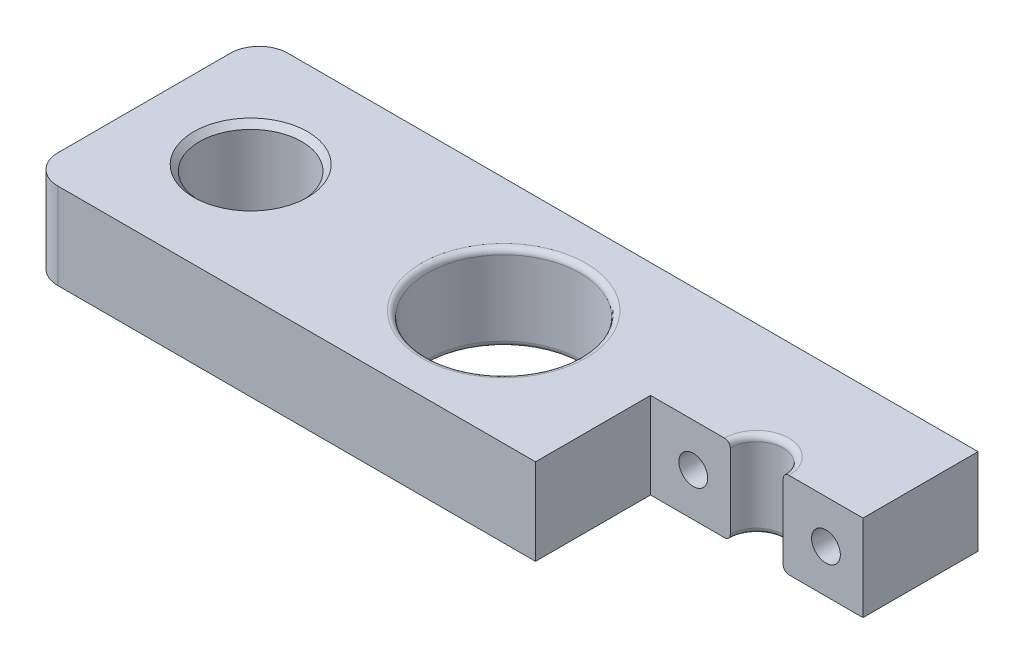
ISO-10303-21;
HEADER;
FILE_DESCRIPTION(('STEP AP214'),'2;1');
FILE_NAME('part.step','',(''),(''),'','','');
FILE_SCHEMA(('AUTOMOTIVE_DESIGN { 1 0 10303 214 1 1 1 1 }'));
ENDSEC;
DATA;
#1=APPLICATION_CONTEXT('core data for automotive mechanical design processes');
#2=APPLICATION_PROTOCOL_DEFINITION('international standard','automotive_design',2000,#1);
#3=PRODUCT_CONTEXT('',#1,'mechanical');
#4=PRODUCT('Part','Part','',(#3));
#5=PRODUCT_RELATED_PRODUCT_CATEGORY('part','',(#4));
#6=PRODUCT_DEFINITION_FORMATION('','',#4);
#7=PRODUCT_DEFINITION_CONTEXT('part definition',#1,'design');
#8=PRODUCT_DEFINITION('design','',#6,#7);
#9=PRODUCT_DEFINITION_SHAPE('','',#8);
#10=(LENGTH_UNIT() NAMED_UNIT(*) SI_UNIT(.MILLI.,.METRE.));
#11=(NAMED_UNIT(*) PLANE_ANGLE_UNIT() SI_UNIT($,.RADIAN.));
#12=(NAMED_UNIT(*) SI_UNIT($,.STERADIAN.) SOLID_ANGLE_UNIT());
#13=UNCERTAINTY_MEASURE_WITH_UNIT(LENGTH_MEASURE(1.E-05),#10,'distance_accuracy_value','');
#14=(GEOMETRIC_REPRESENTATION_CONTEXT(3) GLOBAL_UNCERTAINTY_ASSIGNED_CONTEXT((#13)) GLOBAL_UNIT_ASSIGNED_CONTEXT((#10,
#11,#12)) REPRESENTATION_CONTEXT('',''));
#15=CARTESIAN_POINT('',(0.,0.,0.));
#16=DIRECTION('',(0.,0.,1.));
#17=DIRECTION('',(1.,0.,0.));
#18=AXIS2_PLACEMENT_3D('',#15,#16,#17);
#19=CARTESIAN_POINT('',(0.,15.,0.));
#20=DIRECTION('',(1.,0.,0.));
#21=DIRECTION('',(0.,0.,-1.));
#22=AXIS2_PLACEMENT_3D('',#19,#20,#21);
#23=PLANE('',#22);
#24=DIRECTION('',(0.,0.,1.));
#25=VECTOR('',#24,1.);
#26=CARTESIAN_POINT('',(0.,15.,0.));
#27=LINE('',#26,#25);
#28=CARTESIAN_POINT('',(0.,15.,-35.));
#29=VERTEX_POINT('',#28);
#30=CARTESIAN_POINT('',(0.,15.,-5.));
#31=VERTEX_POINT('',#30);
#32=EDGE_CURVE('E173',#29,#31,#27,.T.);
#33=ORIENTED_EDGE('',*,*,#32,.F.);
#34=DIRECTION('',(0.,-1.,0.));
#35=VECTOR('',#34,1.);
#36=CARTESIAN_POINT('',(0.,15.,-35.));
#37=LINE('',#36,#35);
#38=CARTESIAN_POINT('',(0.,0.,-35.));
#39=VERTEX_POINT('',#38);
#40=EDGE_CURVE('E230',#29,#39,#37,.T.);
#41=ORIENTED_EDGE('',*,*,#40,.T.);
#42=DIRECTION('',(0.,0.,1.));
#43=VECTOR('',#42,1.);
#44=CARTESIAN_POINT('',(0.,0.,0.));
#45=LINE('',#44,#43);
#46=CARTESIAN_POINT('',(0.,0.,-5.));
#47=VERTEX_POINT('',#46);
#48=EDGE_CURVE('E134',#39,#47,#45,.T.);
#49=ORIENTED_EDGE('',*,*,#48,.T.);
#50=DIRECTION('',(0.,-1.,0.));
#51=VECTOR('',#50,1.);
#52=CARTESIAN_POINT('',(0.,15.,-5.));
#53=LINE('',#52,#51);
#54=EDGE_CURVE('E228',#47,#31,#53,.F.);
#55=ORIENTED_EDGE('',*,*,#54,.T.);
#56=EDGE_LOOP('',(#33,#41,#49,#55));
#57=FACE_BOUND('',#56,.T.);
#58=ADVANCED_FACE('F33',(#57),#23,.F.);
#59=CARTESIAN_POINT('',(0.,15.,0.));
#60=DIRECTION('',(0.,0.,-1.));
#61=DIRECTION('',(-1.,0.,0.));
#62=AXIS2_PLACEMENT_3D('',#59,#60,#61);
#63=PLANE('',#62);
#64=DIRECTION('',(1.,0.,0.));
#65=VECTOR('',#64,1.);
#66=CARTESIAN_POINT('',(0.,15.,0.));
#67=LINE('',#66,#65);
#68=CARTESIAN_POINT('',(5.,15.,0.));
#69=VERTEX_POINT('',#68);
#70=CARTESIAN_POINT('',(88.06,15.,0.));
#71=VERTEX_POINT('',#70);
#72=EDGE_CURVE('E175',#69,#71,#67,.T.);
#73=ORIENTED_EDGE('',*,*,#72,.F.);
#74=DIRECTION('',(0.,-1.,0.));
#75=VECTOR('',#74,1.);
#76=CARTESIAN_POINT('',(5.,15.,0.));
#77=LINE('',#76,#75);
#78=CARTESIAN_POINT('',(5.,0.,0.));
#79=VERTEX_POINT('',#78);
#80=EDGE_CURVE('E11',#69,#79,#77,.T.);
#81=ORIENTED_EDGE('',*,*,#80,.T.);
#82=DIRECTION('',(1.,0.,0.));
#83=VECTOR('',#82,1.);
#84=CARTESIAN_POINT('',(0.,0.,0.));
#85=LINE('',#84,#83);
#86=CARTESIAN_POINT('',(88.06,0.,0.));
#87=VERTEX_POINT('',#86);
#88=EDGE_CURVE('E125',#79,#87,#85,.T.);
#89=ORIENTED_EDGE('',*,*,#88,.T.);
#90=DIRECTION('',(0.,1.,0.));
#91=VECTOR('',#90,1.);
#92=CARTESIAN_POINT('',(88.06,-20.2327358505962,0.));
#93=LINE('',#92,#91);
#94=EDGE_CURVE('E129',#87,#71,#93,.T.);
#95=ORIENTED_EDGE('',*,*,#94,.T.);
#96=EDGE_LOOP('',(#73,#81,#89,#95));
#97=FACE_BOUND('',#96,.T.);
#98=ADVANCED_FACE('F127',(#97),#63,.F.);
#99=CARTESIAN_POINT('',(125.,15.,0.));
#100=DIRECTION('',(-1.,0.,0.));
#101=DIRECTION('',(0.,0.,1.));
#102=AXIS2_PLACEMENT_3D('',#99,#100,#101);
#103=PLANE('',#102);
#104=DIRECTION('',(0.,0.,-1.));
#105=VECTOR('',#104,1.);
#106=CARTESIAN_POINT('',(125.,15.,0.));
#107=LINE('',#106,#105);
#108=CARTESIAN_POINT('',(125.,15.,-20.));
#109=VERTEX_POINT('',#108);
#110=CARTESIAN_POINT('',(125.,15.,-40.));
#111=VERTEX_POINT('',#110);
#112=EDGE_CURVE('E178',#109,#111,#107,.T.);
#113=ORIENTED_EDGE('',*,*,#112,.F.);
#114=DIRECTION('',(0.,1.,0.));
#115=VECTOR('',#114,1.);
#116=CARTESIAN_POINT('',(125.,0.,-20.));
#117=LINE('',#116,#115);
#118=CARTESIAN_POINT('',(125.,0.,-20.));
#119=VERTEX_POINT('',#118);
#120=EDGE_CURVE('E158',#119,#109,#117,.T.);
#121=ORIENTED_EDGE('',*,*,#120,.F.);
#122=DIRECTION('',(0.,0.,-1.));
#123=VECTOR('',#122,1.);
#124=CARTESIAN_POINT('',(125.,0.,0.));
#125=LINE('',#124,#123);
#126=CARTESIAN_POINT('',(125.,0.,-40.));
#127=VERTEX_POINT('',#126);
#128=EDGE_CURVE('E133',#119,#127,#125,.T.);
#129=ORIENTED_EDGE('',*,*,#128,.T.);
#130=DIRECTION('',(0.,-1.,0.));
#131=VECTOR('',#130,1.);
#132=CARTESIAN_POINT('',(125.,15.,-40.));
#133=LINE('',#132,#131);
#134=EDGE_CURVE('E182',#111,#127,#133,.T.);
#135=ORIENTED_EDGE('',*,*,#134,.F.);
#136=EDGE_LOOP('',(#113,#121,#129,#135));
#137=FACE_BOUND('',#136,.T.);
#138=ADVANCED_FACE('F253',(#137),#103,.F.);
#139=CARTESIAN_POINT('',(0.,15.,-40.));
#140=DIRECTION('',(0.,0.,1.));
#141=DIRECTION('',(1.,0.,0.));
#142=AXIS2_PLACEMENT_3D('',#139,#140,#141);
#143=PLANE('',#142);
#144=CARTESIAN_POINT('',(118.565,7.5,-40.));
#145=DIRECTION('',(0.,0.,1.));
#146=DIRECTION('',(1.,0.,0.));
#147=AXIS2_PLACEMENT_3D('',#144,#145,#146);
#148=CIRCLE('',#147,2.5);
#149=CARTESIAN_POINT('',(121.065,7.5,-40.));
#150=VERTEX_POINT('',#149);
#151=EDGE_CURVE('E151',#150,#150,#148,.T.);
#152=ORIENTED_EDGE('',*,*,#151,.T.);
#153=EDGE_LOOP('',(#152));
#154=FACE_BOUND('',#153,.T.);
#155=CARTESIAN_POINT('',(95.4916685270529,7.5,-40.));
#156=DIRECTION('',(0.,0.,1.));
#157=DIRECTION('',(1.,0.,0.));
#158=AXIS2_PLACEMENT_3D('',#155,#156,#157);
#159=CIRCLE('',#158,2.49999999999999);
#160=CARTESIAN_POINT('',(97.9916685270529,7.5,-40.));
#161=VERTEX_POINT('',#160);
#162=EDGE_CURVE('E495',#161,#161,#159,.T.);
#163=ORIENTED_EDGE('',*,*,#162,.T.);
#164=EDGE_LOOP('',(#163));
#165=FACE_BOUND('',#164,.T.);
#166=DIRECTION('',(-1.,0.,0.));
#167=VECTOR('',#166,1.);
#168=CARTESIAN_POINT('',(0.,0.,-40.));
#169=LINE('',#168,#167);
#170=CARTESIAN_POINT('',(5.,0.,-40.));
#171=VERTEX_POINT('',#170);
#172=EDGE_CURVE('E176',#127,#171,#169,.T.);
#173=ORIENTED_EDGE('',*,*,#172,.T.);
#174=DIRECTION('',(0.,-1.,0.));
#175=VECTOR('',#174,1.);
#176=CARTESIAN_POINT('',(5.,15.,-40.));
#177=LINE('',#176,#175);
#178=CARTESIAN_POINT('',(5.,15.,-40.));
#179=VERTEX_POINT('',#178);
#180=EDGE_CURVE('E56',#171,#179,#177,.F.);
#181=ORIENTED_EDGE('',*,*,#180,.T.);
#182=DIRECTION('',(-1.,0.,0.));
#183=VECTOR('',#182,1.);
#184=CARTESIAN_POINT('',(0.,15.,-40.));
#185=LINE('',#184,#183);
#186=EDGE_CURVE('E180',#111,#179,#185,.T.);
#187=ORIENTED_EDGE('',*,*,#186,.F.);
#188=ORIENTED_EDGE('',*,*,#134,.T.);
#189=EDGE_LOOP('',(#173,#181,#187,#188));
#190=FACE_BOUND('',#189,.T.);
#191=ADVANCED_FACE('F249',(#154,#165,#190),#143,.F.);
#192=CARTESIAN_POINT('',(0.,15.,0.));
#193=DIRECTION('',(0.,-1.,0.));
#194=DIRECTION('',(0.,0.,-1.));
#195=AXIS2_PLACEMENT_3D('',#192,#193,#194);
#196=PLANE('',#195);
#197=ORIENTED_EDGE('',*,*,#186,.T.);
#198=CARTESIAN_POINT('',(5.,15.,-35.));
#199=DIRECTION('',(0.,-1.,0.));
#200=DIRECTION('',(0.,0.,-1.));
#201=AXIS2_PLACEMENT_3D('',#198,#199,#200);
#202=CIRCLE('',#201,5.);
#203=EDGE_CURVE('E41',#179,#29,#202,.F.);
#204=ORIENTED_EDGE('',*,*,#203,.T.);
#205=ORIENTED_EDGE('',*,*,#32,.T.);
#206=CARTESIAN_POINT('',(5.,15.,-5.));
#207=DIRECTION('',(0.,-1.,0.));
#208=DIRECTION('',(0.,0.,-1.));
#209=AXIS2_PLACEMENT_3D('',#206,#207,#208);
#210=CIRCLE('',#209,5.);
#211=EDGE_CURVE('E48',#31,#69,#210,.F.);
#212=ORIENTED_EDGE('',*,*,#211,.T.);
#213=ORIENTED_EDGE('',*,*,#72,.T.);
#214=DIRECTION('',(0.,0.,-1.));
#215=VECTOR('',#214,1.);
#216=CARTESIAN_POINT('',(88.06,15.,-20.));
#217=LINE('',#216,#215);
#218=CARTESIAN_POINT('',(88.06,15.,-20.));
#219=VERTEX_POINT('',#218);
#220=EDGE_CURVE('E149',#71,#219,#217,.T.);
#221=ORIENTED_EDGE('',*,*,#220,.T.);
#222=DIRECTION('',(-1.,0.,0.));
#223=VECTOR('',#222,1.);
#224=CARTESIAN_POINT('',(85.,15.,-20.));
#225=LINE('',#224,#223);
#226=CARTESIAN_POINT('',(100.926668527053,15.,-20.));
#227=VERTEX_POINT('',#226);
#228=EDGE_CURVE('E161',#227,#219,#225,.T.);
#229=ORIENTED_EDGE('',*,*,#228,.F.);
#230=CARTESIAN_POINT('',(106.526668527053,15.,-20.));
#231=DIRECTION('',(0.,-1.,0.));
#232=DIRECTION('',(0.,0.,-1.));
#233=AXIS2_PLACEMENT_3D('',#230,#231,#232);
#234=CIRCLE('',#233,5.60000000000001);
#235=CARTESIAN_POINT('',(112.126668527053,15.,-20.));
#236=VERTEX_POINT('',#235);
#237=EDGE_CURVE('E221',#227,#236,#234,.T.);
#238=ORIENTED_EDGE('',*,*,#237,.T.);
#239=EDGE_CURVE('E159',#109,#236,#225,.T.);
#240=ORIENTED_EDGE('',*,*,#239,.F.);
#241=ORIENTED_EDGE('',*,*,#112,.T.);
#242=EDGE_LOOP('',(#197,#204,#205,#212,#213,#221,#229,#238,#240,#241));
#243=FACE_BOUND('',#242,.T.);
#244=CARTESIAN_POINT('',(62.5266685270529,15.,-20.));
#245=DIRECTION('',(0.,-1.,0.));
#246=DIRECTION('',(0.,0.,-1.));
#247=AXIS2_PLACEMENT_3D('',#244,#245,#246);
#248=CIRCLE('',#247,14.3);
#249=CARTESIAN_POINT('',(62.5266685270529,15.,-34.3));
#250=VERTEX_POINT('',#249);
#251=EDGE_CURVE('E218',#250,#250,#248,.T.);
#252=ORIENTED_EDGE('',*,*,#251,.T.);
#253=EDGE_LOOP('',(#252));
#254=FACE_BOUND('',#253,.T.);
#255=CARTESIAN_POINT('',(18.5266685270529,15.,-20.));
#256=DIRECTION('',(0.,-1.,0.));
#257=DIRECTION('',(0.,0.,-1.));
#258=AXIS2_PLACEMENT_3D('',#255,#256,#257);
#259=CIRCLE('',#258,9.90000000000002);
#260=CARTESIAN_POINT('',(18.5266685270529,15.,-29.9));
#261=VERTEX_POINT('',#260);
#262=EDGE_CURVE('E192',#261,#261,#259,.T.);
#263=ORIENTED_EDGE('',*,*,#262,.T.);
#264=EDGE_LOOP('',(#263));
#265=FACE_BOUND('',#264,.T.);
#266=ADVANCED_FACE('F240',(#243,#254,#265),#196,.F.);
#267=CARTESIAN_POINT('',(0.,0.,0.));
#268=DIRECTION('',(0.,-1.,0.));
#269=DIRECTION('',(0.,0.,-1.));
#270=AXIS2_PLACEMENT_3D('',#267,#268,#269);
#271=PLANE('',#270);
#272=ORIENTED_EDGE('',*,*,#48,.F.);
#273=CARTESIAN_POINT('',(5.,0.,-35.));
#274=DIRECTION('',(0.,-1.,0.));
#275=DIRECTION('',(0.,0.,-1.));
#276=AXIS2_PLACEMENT_3D('',#273,#274,#275);
#277=CIRCLE('',#276,5.);
#278=EDGE_CURVE('E235',#39,#171,#277,.T.);
#279=ORIENTED_EDGE('',*,*,#278,.T.);
#280=ORIENTED_EDGE('',*,*,#172,.F.);
#281=ORIENTED_EDGE('',*,*,#128,.F.);
#282=DIRECTION('',(-1.,0.,0.));
#283=VECTOR('',#282,1.);
#284=CARTESIAN_POINT('',(85.,0.,-20.));
#285=LINE('',#284,#283);
#286=CARTESIAN_POINT('',(112.126668527053,0.,-20.));
#287=VERTEX_POINT('',#286);
#288=EDGE_CURVE('E155',#119,#287,#285,.T.);
#289=ORIENTED_EDGE('',*,*,#288,.T.);
#290=CARTESIAN_POINT('',(106.526668527053,0.,-20.));
#291=DIRECTION('',(0.,-1.,0.));
#292=DIRECTION('',(0.,0.,-1.));
#293=AXIS2_PLACEMENT_3D('',#290,#291,#292);
#294=CIRCLE('',#293,5.60000000000001);
#295=CARTESIAN_POINT('',(100.926668527053,0.,-20.));
#296=VERTEX_POINT('',#295);
#297=EDGE_CURVE('E201',#287,#296,#294,.F.);
#298=ORIENTED_EDGE('',*,*,#297,.T.);
#299=CARTESIAN_POINT('',(88.06,0.,-20.));
#300=VERTEX_POINT('',#299);
#301=EDGE_CURVE('E142',#296,#300,#285,.T.);
#302=ORIENTED_EDGE('',*,*,#301,.T.);
#303=DIRECTION('',(0.,0.,-1.));
#304=VECTOR('',#303,1.);
#305=CARTESIAN_POINT('',(88.06,0.,-20.));
#306=LINE('',#305,#304);
#307=EDGE_CURVE('E137',#87,#300,#306,.T.);
#308=ORIENTED_EDGE('',*,*,#307,.F.);
#309=ORIENTED_EDGE('',*,*,#88,.F.);
#310=CARTESIAN_POINT('',(5.,0.,-5.));
#311=DIRECTION('',(0.,-1.,0.));
#312=DIRECTION('',(0.,0.,-1.));
#313=AXIS2_PLACEMENT_3D('',#310,#311,#312);
#314=CIRCLE('',#313,5.);
#315=EDGE_CURVE('E233',#79,#47,#314,.T.);
#316=ORIENTED_EDGE('',*,*,#315,.T.);
#317=EDGE_LOOP('',(#272,#279,#280,#281,#289,#298,#302,#308,#309,#316));
#318=FACE_BOUND('',#317,.T.);
#319=CARTESIAN_POINT('',(62.5266685270529,0.,-20.));
#320=DIRECTION('',(0.,-1.,0.));
#321=DIRECTION('',(0.,0.,-1.));
#322=AXIS2_PLACEMENT_3D('',#319,#320,#321);
#323=CIRCLE('',#322,14.3);
#324=CARTESIAN_POINT('',(62.5266685270529,0.,-34.3));
#325=VERTEX_POINT('',#324);
#326=EDGE_CURVE('E203',#325,#325,#323,.F.);
#327=ORIENTED_EDGE('',*,*,#326,.T.);
#328=EDGE_LOOP('',(#327));
#329=FACE_BOUND('',#328,.T.);
#330=CARTESIAN_POINT('',(18.5266685270529,0.,-20.));
#331=DIRECTION('',(0.,-1.,0.));
#332=DIRECTION('',(0.,0.,-1.));
#333=AXIS2_PLACEMENT_3D('',#330,#331,#332);
#334=CIRCLE('',#333,9.89999999999996);
#335=CARTESIAN_POINT('',(18.5266685270529,0.,-29.9));
#336=VERTEX_POINT('',#335);
#337=EDGE_CURVE('E195',#336,#336,#334,.F.);
#338=ORIENTED_EDGE('',*,*,#337,.T.);
#339=EDGE_LOOP('',(#338));
#340=FACE_BOUND('',#339,.T.);
#341=ADVANCED_FACE('F139',(#318,#329,#340),#271,.T.);
#342=CARTESIAN_POINT('',(62.5266685270529,0.,-20.));
#343=DIRECTION('',(0.,1.,0.));
#344=DIRECTION('',(0.,0.,1.));
#345=AXIS2_PLACEMENT_3D('',#342,#343,#344);
#346=CYLINDRICAL_SURFACE('',#345,13.3);
#347=CARTESIAN_POINT('',(62.5266685270529,1.,-20.));
#348=DIRECTION('',(0.,-1.,0.));
#349=DIRECTION('',(0.,0.,-1.));
#350=AXIS2_PLACEMENT_3D('',#347,#348,#349);
#351=CIRCLE('',#350,13.3);
#352=CARTESIAN_POINT('',(62.5266685270529,1.,-33.3));
#353=VERTEX_POINT('',#352);
#354=EDGE_CURVE('E209',#353,#353,#351,.T.);
#355=ORIENTED_EDGE('',*,*,#354,.T.);
#356=EDGE_LOOP('',(#355));
#357=FACE_BOUND('',#356,.T.);
#358=CARTESIAN_POINT('',(62.5266685270529,14.,-20.));
#359=DIRECTION('',(0.,-1.,0.));
#360=DIRECTION('',(0.,0.,-1.));
#361=AXIS2_PLACEMENT_3D('',#358,#359,#360);
#362=CIRCLE('',#361,13.3);
#363=CARTESIAN_POINT('',(62.5266685270529,14.,-33.3));
#364=VERTEX_POINT('',#363);
#365=EDGE_CURVE('E206',#364,#364,#362,.F.);
#366=ORIENTED_EDGE('',*,*,#365,.T.);
#367=EDGE_LOOP('',(#366));
#368=FACE_BOUND('',#367,.T.);
#369=ADVANCED_FACE('F321',(#357,#368),#346,.F.);
#370=CARTESIAN_POINT('',(106.526668527053,0.,-20.));
#371=DIRECTION('',(0.,1.,0.));
#372=DIRECTION('',(0.,0.,1.));
#373=AXIS2_PLACEMENT_3D('',#370,#371,#372);
#374=CYLINDRICAL_SURFACE('',#373,4.60000000000001);
#375=CARTESIAN_POINT('',(106.526668527053,14.,-20.));
#376=DIRECTION('',(0.,-1.,0.));
#377=DIRECTION('',(0.,0.,-1.));
#378=AXIS2_PLACEMENT_3D('',#375,#376,#377);
#379=CIRCLE('',#378,4.60000000000001);
#380=CARTESIAN_POINT('',(111.126668527053,14.,-20.));
#381=VERTEX_POINT('',#380);
#382=CARTESIAN_POINT('',(101.926668527053,14.,-20.));
#383=VERTEX_POINT('',#382);
#384=EDGE_CURVE('E212',#381,#383,#379,.F.);
#385=ORIENTED_EDGE('',*,*,#384,.T.);
#386=DIRECTION('',(0.,1.,0.));
#387=VECTOR('',#386,1.);
#388=CARTESIAN_POINT('',(101.926668527053,0.,-20.));
#389=LINE('',#388,#387);
#390=CARTESIAN_POINT('',(101.926668527053,1.,-20.));
#391=VERTEX_POINT('',#390);
#392=EDGE_CURVE('E163',#383,#391,#389,.F.);
#393=ORIENTED_EDGE('',*,*,#392,.T.);
#394=CARTESIAN_POINT('',(106.526668527053,1.,-20.));
#395=DIRECTION('',(0.,-1.,0.));
#396=DIRECTION('',(0.,0.,-1.));
#397=AXIS2_PLACEMENT_3D('',#394,#395,#396);
#398=CIRCLE('',#397,4.60000000000001);
#399=CARTESIAN_POINT('',(111.126668527053,1.,-20.));
#400=VERTEX_POINT('',#399);
#401=EDGE_CURVE('E215',#391,#400,#398,.T.);
#402=ORIENTED_EDGE('',*,*,#401,.T.);
#403=DIRECTION('',(0.,1.,0.));
#404=VECTOR('',#403,1.);
#405=CARTESIAN_POINT('',(111.126668527053,0.,-20.));
#406=LINE('',#405,#404);
#407=EDGE_CURVE('E168',#400,#381,#406,.T.);
#408=ORIENTED_EDGE('',*,*,#407,.T.);
#409=EDGE_LOOP('',(#385,#393,#402,#408));
#410=FACE_BOUND('',#409,.T.);
#411=ADVANCED_FACE('F267',(#410),#374,.F.);
#412=CARTESIAN_POINT('',(18.5266685270529,0.,-20.));
#413=DIRECTION('',(0.,1.,0.));
#414=DIRECTION('',(0.,0.,1.));
#415=AXIS2_PLACEMENT_3D('',#412,#413,#414);
#416=CYLINDRICAL_SURFACE('',#415,8.9);
#417=CARTESIAN_POINT('',(18.5266685270529,0.999999999999977,-20.));
#418=DIRECTION('',(0.,-1.,0.));
#419=DIRECTION('',(0.,0.,-1.));
#420=AXIS2_PLACEMENT_3D('',#417,#418,#419);
#421=CIRCLE('',#420,8.9);
#422=CARTESIAN_POINT('',(18.5266685270529,0.999999999999977,-28.9));
#423=VERTEX_POINT('',#422);
#424=EDGE_CURVE('E198',#423,#423,#421,.T.);
#425=ORIENTED_EDGE('',*,*,#424,.T.);
#426=EDGE_LOOP('',(#425));
#427=FACE_BOUND('',#426,.T.);
#428=CARTESIAN_POINT('',(18.5266685270529,14.,-20.));
#429=DIRECTION('',(0.,-1.,0.));
#430=DIRECTION('',(0.,0.,-1.));
#431=AXIS2_PLACEMENT_3D('',#428,#429,#430);
#432=CIRCLE('',#431,8.9);
#433=CARTESIAN_POINT('',(18.5266685270529,14.,-28.9));
#434=VERTEX_POINT('',#433);
#435=EDGE_CURVE('E189',#434,#434,#432,.F.);
#436=ORIENTED_EDGE('',*,*,#435,.T.);
#437=EDGE_LOOP('',(#436));
#438=FACE_BOUND('',#437,.T.);
#439=ADVANCED_FACE('F296',(#427,#438),#416,.F.);
#440=CARTESIAN_POINT('',(18.5266685270529,14.,-20.));
#441=DIRECTION('',(0.,1.,0.));
#442=DIRECTION('',(0.,0.,1.));
#443=AXIS2_PLACEMENT_3D('',#440,#441,#442);
#444=CONICAL_SURFACE('',#443,8.9,0.785398163397454);
#445=ORIENTED_EDGE('',*,*,#262,.F.);
#446=EDGE_LOOP('',(#445));
#447=FACE_BOUND('',#446,.T.);
#448=ORIENTED_EDGE('',*,*,#435,.F.);
#449=EDGE_LOOP('',(#448));
#450=FACE_BOUND('',#449,.T.);
#451=ADVANCED_FACE('F292',(#447,#450),#444,.F.);
#452=CARTESIAN_POINT('',(18.5266685270529,0.,-20.));
#453=DIRECTION('',(0.,-1.,0.));
#454=DIRECTION('',(0.,0.,-1.));
#455=AXIS2_PLACEMENT_3D('',#452,#453,#454);
#456=CONICAL_SURFACE('',#455,9.89999999999996,0.785398163397443);
#457=ORIENTED_EDGE('',*,*,#424,.F.);
#458=EDGE_LOOP('',(#457));
#459=FACE_BOUND('',#458,.T.);
#460=ORIENTED_EDGE('',*,*,#337,.F.);
#461=EDGE_LOOP('',(#460));
#462=FACE_BOUND('',#461,.T.);
#463=ADVANCED_FACE('F295',(#459,#462),#456,.F.);
#464=CARTESIAN_POINT('',(62.5266685270529,1.,-20.));
#465=DIRECTION('',(0.,-1.,0.));
#466=DIRECTION('',(0.,0.,-1.));
#467=AXIS2_PLACEMENT_3D('',#464,#465,#466);
#468=TOROIDAL_SURFACE('',#467,14.3,1.);
#469=ORIENTED_EDGE('',*,*,#354,.F.);
#470=EDGE_LOOP('',(#469));
#471=FACE_BOUND('',#470,.T.);
#472=ORIENTED_EDGE('',*,*,#326,.F.);
#473=EDGE_LOOP('',(#472));
#474=FACE_BOUND('',#473,.T.);
#475=ADVANCED_FACE('F300',(#471,#474),#468,.T.);
#476=CARTESIAN_POINT('',(106.526668527053,1.,-20.));
#477=DIRECTION('',(0.,-1.,0.));
#478=DIRECTION('',(0.,0.,-1.));
#479=AXIS2_PLACEMENT_3D('',#476,#477,#478);
#480=TOROIDAL_SURFACE('',#479,5.60000000000001,1.);
#481=CARTESIAN_POINT('',(112.126668527053,1.,-20.));
#482=DIRECTION('',(0.,0.,-1.));
#483=DIRECTION('',(-1.,0.,0.));
#484=AXIS2_PLACEMENT_3D('',#481,#482,#483);
#485=CIRCLE('',#484,1.);
#486=EDGE_CURVE('E171',#400,#287,#485,.F.);
#487=ORIENTED_EDGE('',*,*,#486,.F.);
#488=ORIENTED_EDGE('',*,*,#401,.F.);
#489=CARTESIAN_POINT('',(100.926668527053,1.,-20.));
#490=DIRECTION('',(0.,0.,-1.));
#491=DIRECTION('',(-1.,0.,0.));
#492=AXIS2_PLACEMENT_3D('',#489,#490,#491);
#493=CIRCLE('',#492,1.);
#494=EDGE_CURVE('E166',#296,#391,#493,.F.);
#495=ORIENTED_EDGE('',*,*,#494,.F.);
#496=ORIENTED_EDGE('',*,*,#297,.F.);
#497=EDGE_LOOP('',(#487,#488,#495,#496));
#498=FACE_BOUND('',#497,.T.);
#499=ADVANCED_FACE('F260',(#498),#480,.T.);
#500=CARTESIAN_POINT('',(106.526668527053,14.,-20.));
#501=DIRECTION('',(0.,-1.,0.));
#502=DIRECTION('',(0.,0.,-1.));
#503=AXIS2_PLACEMENT_3D('',#500,#501,#502);
#504=TOROIDAL_SURFACE('',#503,5.60000000000001,1.);
#505=CARTESIAN_POINT('',(112.126668527053,14.,-20.));
#506=DIRECTION('',(0.,0.,-1.));
#507=DIRECTION('',(-1.,0.,0.));
#508=AXIS2_PLACEMENT_3D('',#505,#506,#507);
#509=CIRCLE('',#508,1.);
#510=EDGE_CURVE('E226',#236,#381,#509,.F.);
#511=ORIENTED_EDGE('',*,*,#510,.F.);
#512=ORIENTED_EDGE('',*,*,#237,.F.);
#513=CARTESIAN_POINT('',(100.926668527053,14.,-20.));
#514=DIRECTION('',(0.,0.,-1.));
#515=DIRECTION('',(-1.,0.,0.));
#516=AXIS2_PLACEMENT_3D('',#513,#514,#515);
#517=CIRCLE('',#516,1.);
#518=EDGE_CURVE('E224',#383,#227,#517,.F.);
#519=ORIENTED_EDGE('',*,*,#518,.F.);
#520=ORIENTED_EDGE('',*,*,#384,.F.);
#521=EDGE_LOOP('',(#511,#512,#519,#520));
#522=FACE_BOUND('',#521,.T.);
#523=ADVANCED_FACE('F271',(#522),#504,.T.);
#524=CARTESIAN_POINT('',(62.5266685270529,14.,-20.));
#525=DIRECTION('',(0.,-1.,0.));
#526=DIRECTION('',(0.,0.,-1.));
#527=AXIS2_PLACEMENT_3D('',#524,#525,#526);
#528=TOROIDAL_SURFACE('',#527,14.3,1.);
#529=ORIENTED_EDGE('',*,*,#251,.F.);
#530=EDGE_LOOP('',(#529));
#531=FACE_BOUND('',#530,.T.);
#532=ORIENTED_EDGE('',*,*,#365,.F.);
#533=EDGE_LOOP('',(#532));
#534=FACE_BOUND('',#533,.T.);
#535=ADVANCED_FACE('F309',(#531,#534),#528,.T.);
#536=CARTESIAN_POINT('',(85.,0.,-20.));
#537=DIRECTION('',(0.,0.,-1.));
#538=DIRECTION('',(-1.,0.,0.));
#539=AXIS2_PLACEMENT_3D('',#536,#537,#538);
#540=PLANE('',#539);
#541=CARTESIAN_POINT('',(95.4916685270529,7.5,-20.));
#542=DIRECTION('',(0.,0.,1.));
#543=DIRECTION('',(1.,0.,0.));
#544=AXIS2_PLACEMENT_3D('',#541,#542,#543);
#545=CIRCLE('',#544,2.49999999999999);
#546=CARTESIAN_POINT('',(97.9916685270529,7.5,-20.));
#547=VERTEX_POINT('',#546);
#548=EDGE_CURVE('E500',#547,#547,#545,.T.);
#549=ORIENTED_EDGE('',*,*,#548,.F.);
#550=EDGE_LOOP('',(#549));
#551=FACE_BOUND('',#550,.T.);
#552=ORIENTED_EDGE('',*,*,#228,.T.);
#553=DIRECTION('',(0.,1.,0.));
#554=VECTOR('',#553,1.);
#555=CARTESIAN_POINT('',(88.06,-20.2327358505962,-20.));
#556=LINE('',#555,#554);
#557=EDGE_CURVE('E145',#300,#219,#556,.T.);
#558=ORIENTED_EDGE('',*,*,#557,.F.);
#559=ORIENTED_EDGE('',*,*,#301,.F.);
#560=ORIENTED_EDGE('',*,*,#494,.T.);
#561=ORIENTED_EDGE('',*,*,#392,.F.);
#562=ORIENTED_EDGE('',*,*,#518,.T.);
#563=EDGE_LOOP('',(#552,#558,#559,#560,#561,#562));
#564=FACE_BOUND('',#563,.T.);
#565=ADVANCED_FACE('F264',(#551,#564),#540,.F.);
#566=CARTESIAN_POINT('',(118.565,7.5,-20.));
#567=DIRECTION('',(0.,0.,1.));
#568=DIRECTION('',(1.,0.,0.));
#569=AXIS2_PLACEMENT_3D('',#566,#567,#568);
#570=CIRCLE('',#569,2.5);
#571=CARTESIAN_POINT('',(121.065,7.5,-20.));
#572=VERTEX_POINT('',#571);
#573=EDGE_CURVE('E493',#572,#572,#570,.T.);
#574=ORIENTED_EDGE('',*,*,#573,.F.);
#575=EDGE_LOOP('',(#574));
#576=FACE_BOUND('',#575,.T.);
#577=ORIENTED_EDGE('',*,*,#486,.T.);
#578=ORIENTED_EDGE('',*,*,#288,.F.);
#579=ORIENTED_EDGE('',*,*,#120,.T.);
#580=ORIENTED_EDGE('',*,*,#239,.T.);
#581=ORIENTED_EDGE('',*,*,#510,.T.);
#582=ORIENTED_EDGE('',*,*,#407,.F.);
#583=EDGE_LOOP('',(#577,#578,#579,#580,#581,#582));
#584=FACE_BOUND('',#583,.T.);
#585=ADVANCED_FACE('F283',(#576,#584),#540,.F.);
#586=CARTESIAN_POINT('',(5.,15.,-35.));
#587=DIRECTION('',(0.,-1.,0.));
#588=DIRECTION('',(0.,0.,-1.));
#589=AXIS2_PLACEMENT_3D('',#586,#587,#588);
#590=CYLINDRICAL_SURFACE('',#589,5.);
#591=ORIENTED_EDGE('',*,*,#203,.F.);
#592=ORIENTED_EDGE('',*,*,#180,.F.);
#593=ORIENTED_EDGE('',*,*,#278,.F.);
#594=ORIENTED_EDGE('',*,*,#40,.F.);
#595=EDGE_LOOP('',(#591,#592,#593,#594));
#596=FACE_BOUND('',#595,.T.);
#597=ADVANCED_FACE('F246',(#596),#590,.T.);
#598=CARTESIAN_POINT('',(5.,15.,-5.));
#599=DIRECTION('',(0.,-1.,0.));
#600=DIRECTION('',(0.,0.,-1.));
#601=AXIS2_PLACEMENT_3D('',#598,#599,#600);
#602=CYLINDRICAL_SURFACE('',#601,5.);
#603=ORIENTED_EDGE('',*,*,#211,.F.);
#604=ORIENTED_EDGE('',*,*,#54,.F.);
#605=ORIENTED_EDGE('',*,*,#315,.F.);
#606=ORIENTED_EDGE('',*,*,#80,.F.);
#607=EDGE_LOOP('',(#603,#604,#605,#606));
#608=FACE_BOUND('',#607,.T.);
#609=ADVANCED_FACE('F35',(#608),#602,.T.);
#610=CARTESIAN_POINT('',(88.06,-20.2327358505962,-20.));
#611=DIRECTION('',(1.,0.,0.));
#612=DIRECTION('',(0.,0.,-1.));
#613=AXIS2_PLACEMENT_3D('',#610,#611,#612);
#614=PLANE('',#613);
#615=ORIENTED_EDGE('',*,*,#94,.F.);
#616=ORIENTED_EDGE('',*,*,#307,.T.);
#617=ORIENTED_EDGE('',*,*,#557,.T.);
#618=ORIENTED_EDGE('',*,*,#220,.F.);
#619=EDGE_LOOP('',(#615,#616,#617,#618));
#620=FACE_BOUND('',#619,.T.);
#621=ADVANCED_FACE('F147',(#620),#614,.T.);
#622=CARTESIAN_POINT('',(118.565,7.5,-40.));
#623=DIRECTION('',(0.,0.,1.));
#624=DIRECTION('',(1.,0.,0.));
#625=AXIS2_PLACEMENT_3D('',#622,#623,#624);
#626=CYLINDRICAL_SURFACE('',#625,2.5);
#627=ORIENTED_EDGE('',*,*,#151,.F.);
#628=EDGE_LOOP('',(#627));
#629=FACE_BOUND('',#628,.T.);
#630=ORIENTED_EDGE('',*,*,#573,.T.);
#631=EDGE_LOOP('',(#630));
#632=FACE_BOUND('',#631,.T.);
#633=ADVANCED_FACE('F281',(#629,#632),#626,.F.);
#634=CARTESIAN_POINT('',(95.4916685270529,7.5,-40.));
#635=DIRECTION('',(0.,0.,1.));
#636=DIRECTION('',(1.,0.,0.));
#637=AXIS2_PLACEMENT_3D('',#634,#635,#636);
#638=CYLINDRICAL_SURFACE('',#637,2.49999999999999);
#639=ORIENTED_EDGE('',*,*,#162,.F.);
#640=EDGE_LOOP('',(#639));
#641=FACE_BOUND('',#640,.T.);
#642=ORIENTED_EDGE('',*,*,#548,.T.);
#643=EDGE_LOOP('',(#642));
#644=FACE_BOUND('',#643,.T.);
#645=ADVANCED_FACE('F372',(#641,#644),#638,.F.);
#646=CLOSED_SHELL('',(#58,#98,#138,#191,#266,#341,#369,#411,#439,#451,#463,#475,#499,#523,#535,
#565,#585,#597,#609,#621,#633,#645));
#647=MANIFOLD_SOLID_BREP('B2',#646);
#648=ADVANCED_BREP_SHAPE_REPRESENTATION('',(#18,#647),#14);
#649=SHAPE_DEFINITION_REPRESENTATION(#9,#648);
ENDSEC;
END-ISO-10303-21;
